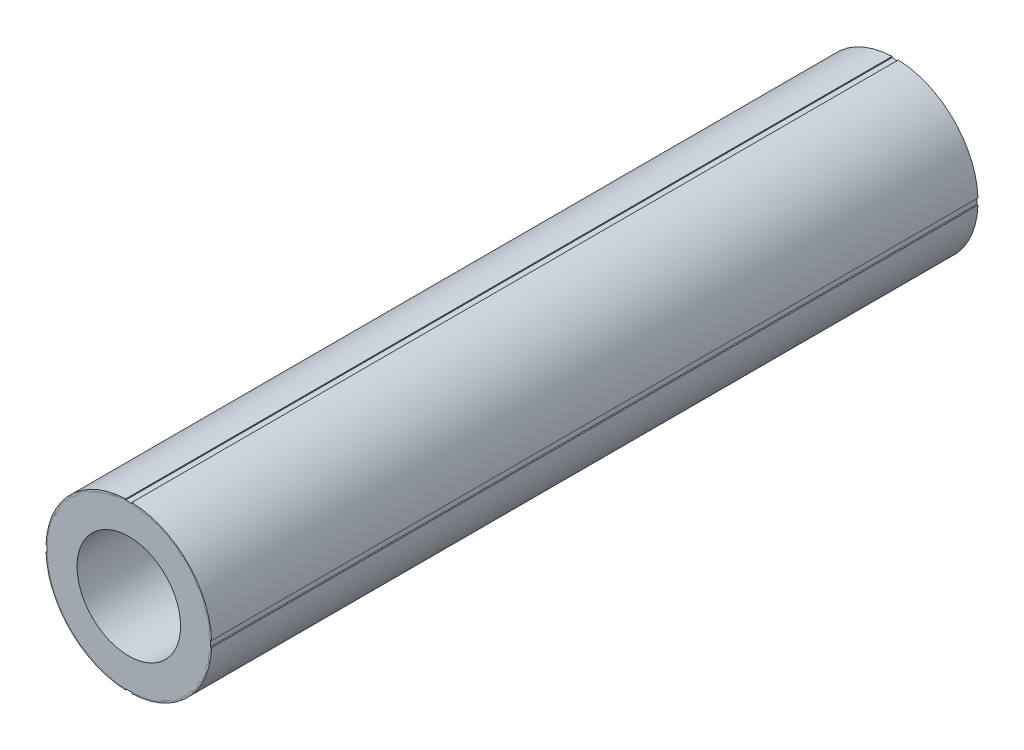
ISO-10303-21;
HEADER;
FILE_DESCRIPTION(('STEP AP214'),'2;1');
FILE_NAME('part.step','',(''),(''),'','','');
FILE_SCHEMA(('AUTOMOTIVE_DESIGN { 1 0 10303 214 1 1 1 1 }'));
ENDSEC;
DATA;
#1=APPLICATION_CONTEXT('core data for automotive mechanical design processes');
#2=APPLICATION_PROTOCOL_DEFINITION('international standard','automotive_design',2000,#1);
#3=PRODUCT_CONTEXT('',#1,'mechanical');
#4=PRODUCT('Part','Part','',(#3));
#5=PRODUCT_RELATED_PRODUCT_CATEGORY('part','',(#4));
#6=PRODUCT_DEFINITION_FORMATION('','',#4);
#7=PRODUCT_DEFINITION_CONTEXT('part definition',#1,'design');
#8=PRODUCT_DEFINITION('design','',#6,#7);
#9=PRODUCT_DEFINITION_SHAPE('','',#8);
#10=(LENGTH_UNIT() NAMED_UNIT(*) SI_UNIT(.MILLI.,.METRE.));
#11=(NAMED_UNIT(*) PLANE_ANGLE_UNIT() SI_UNIT($,.RADIAN.));
#12=(NAMED_UNIT(*) SI_UNIT($,.STERADIAN.) SOLID_ANGLE_UNIT());
#13=UNCERTAINTY_MEASURE_WITH_UNIT(LENGTH_MEASURE(1.E-05),#10,'distance_accuracy_value','');
#14=(GEOMETRIC_REPRESENTATION_CONTEXT(3) GLOBAL_UNCERTAINTY_ASSIGNED_CONTEXT((#13)) GLOBAL_UNIT_ASSIGNED_CONTEXT((#10,
#11,#12)) REPRESENTATION_CONTEXT('',''));
#15=CARTESIAN_POINT('',(0.,0.,0.));
#16=DIRECTION('',(0.,0.,1.));
#17=DIRECTION('',(1.,0.,0.));
#18=AXIS2_PLACEMENT_3D('',#15,#16,#17);
#19=CARTESIAN_POINT('',(0.,0.,3.7));
#20=DIRECTION('',(0.,0.,1.));
#21=DIRECTION('',(1.,0.,0.));
#22=AXIS2_PLACEMENT_3D('',#19,#20,#21);
#23=PLANE('',#22);
#24=CARTESIAN_POINT('',(0.,0.,3.7));
#25=DIRECTION('',(0.,0.,1.));
#26=DIRECTION('',(1.,0.,0.));
#27=AXIS2_PLACEMENT_3D('',#24,#25,#26);
#28=CIRCLE('',#27,0.395);
#29=CARTESIAN_POINT('',(0.395,0.,3.7));
#30=VERTEX_POINT('',#29);
#31=EDGE_CURVE('E12',#30,#30,#28,.T.);
#32=ORIENTED_EDGE('',*,*,#31,.T.);
#33=EDGE_LOOP('',(#32));
#34=FACE_BOUND('',#33,.T.);
#35=CARTESIAN_POINT('',(0.,0.,3.7));
#36=DIRECTION('',(0.,0.,1.));
#37=DIRECTION('',(1.,0.,0.));
#38=AXIS2_PLACEMENT_3D('',#35,#36,#37);
#39=CIRCLE('',#38,0.25);
#40=CARTESIAN_POINT('',(0.25,0.,3.7));
#41=VERTEX_POINT('',#40);
#42=EDGE_CURVE('E249',#41,#41,#39,.T.);
#43=ORIENTED_EDGE('',*,*,#42,.F.);
#44=EDGE_LOOP('',(#43));
#45=FACE_BOUND('',#44,.T.);
#46=ADVANCED_FACE('F236',(#34,#45),#23,.T.);
#47=CARTESIAN_POINT('',(0.,0.,0.));
#48=DIRECTION('',(0.,0.,1.));
#49=DIRECTION('',(1.,0.,0.));
#50=AXIS2_PLACEMENT_3D('',#47,#48,#49);
#51=PLANE('',#50);
#52=CARTESIAN_POINT('',(0.,0.,0.));
#53=DIRECTION('',(0.,0.,1.));
#54=DIRECTION('',(1.,0.,0.));
#55=AXIS2_PLACEMENT_3D('',#52,#53,#54);
#56=CIRCLE('',#55,0.395);
#57=CARTESIAN_POINT('',(0.395,0.,0.));
#58=VERTEX_POINT('',#57);
#59=EDGE_CURVE('E240',#58,#58,#56,.T.);
#60=ORIENTED_EDGE('',*,*,#59,.F.);
#61=EDGE_LOOP('',(#60));
#62=FACE_BOUND('',#61,.T.);
#63=CARTESIAN_POINT('',(0.,0.,0.));
#64=DIRECTION('',(0.,0.,1.));
#65=DIRECTION('',(1.,0.,0.));
#66=AXIS2_PLACEMENT_3D('',#63,#64,#65);
#67=CIRCLE('',#66,0.25);
#68=CARTESIAN_POINT('',(0.25,0.,0.));
#69=VERTEX_POINT('',#68);
#70=EDGE_CURVE('E247',#69,#69,#67,.T.);
#71=ORIENTED_EDGE('',*,*,#70,.T.);
#72=EDGE_LOOP('',(#71));
#73=FACE_BOUND('',#72,.T.);
#74=ADVANCED_FACE('F255',(#62,#73),#51,.F.);
#75=CARTESIAN_POINT('',(0.,0.,3.7));
#76=DIRECTION('',(0.,0.,-1.));
#77=DIRECTION('',(-1.,0.,0.));
#78=AXIS2_PLACEMENT_3D('',#75,#76,#77);
#79=CYLINDRICAL_SURFACE('',#78,0.395);
#80=ORIENTED_EDGE('',*,*,#31,.F.);
#81=EDGE_LOOP('',(#80));
#82=FACE_BOUND('',#81,.T.);
#83=ORIENTED_EDGE('',*,*,#59,.T.);
#84=EDGE_LOOP('',(#83));
#85=FACE_BOUND('',#84,.T.);
#86=ADVANCED_FACE('F238',(#82,#85),#79,.T.);
#87=CARTESIAN_POINT('',(0.,0.,0.));
#88=DIRECTION('',(0.,0.,1.));
#89=DIRECTION('',(1.,0.,0.));
#90=AXIS2_PLACEMENT_3D('',#87,#88,#89);
#91=CYLINDRICAL_SURFACE('',#90,0.25);
#92=ORIENTED_EDGE('',*,*,#70,.F.);
#93=EDGE_LOOP('',(#92));
#94=FACE_BOUND('',#93,.T.);
#95=ORIENTED_EDGE('',*,*,#42,.T.);
#96=EDGE_LOOP('',(#95));
#97=FACE_BOUND('',#96,.T.);
#98=ADVANCED_FACE('F257',(#94,#97),#91,.F.);
#99=CLOSED_SHELL('',(#46,#74,#86,#98));
#100=MANIFOLD_SOLID_BREP('B2',#99);
#101=CARTESIAN_POINT('',(0.,0.,3.7));
#102=DIRECTION('',(0.,0.,1.));
#103=DIRECTION('',(1.,0.,0.));
#104=AXIS2_PLACEMENT_3D('',#101,#102,#103);
#105=PLANE('',#104);
#106=CARTESIAN_POINT('',(0.,0.,3.7));
#107=DIRECTION('',(0.,0.,1.));
#108=DIRECTION('',(1.,0.,0.));
#109=AXIS2_PLACEMENT_3D('',#106,#107,#108);
#110=CIRCLE('',#109,0.39);
#111=CARTESIAN_POINT('',(0.015,-0.389711431702997,3.7));
#112=VERTEX_POINT('',#111);
#113=CARTESIAN_POINT('',(0.389711431702997,-0.0150000000000004,3.7));
#114=VERTEX_POINT('',#113);
#115=EDGE_CURVE('E317',#112,#114,#110,.T.);
#116=ORIENTED_EDGE('',*,*,#115,.F.);
#117=DIRECTION('',(0.,1.,0.));
#118=VECTOR('',#117,1.);
#119=CARTESIAN_POINT('',(0.015,-0.500000000000001,3.7));
#120=LINE('',#119,#118);
#121=CARTESIAN_POINT('',(0.015,-0.399718651053463,3.7));
#122=VERTEX_POINT('',#121);
#123=EDGE_CURVE('E323',#122,#112,#120,.T.);
#124=ORIENTED_EDGE('',*,*,#123,.F.);
#125=CARTESIAN_POINT('',(0.,0.,3.7));
#126=DIRECTION('',(0.,0.,1.));
#127=DIRECTION('',(1.,0.,0.));
#128=AXIS2_PLACEMENT_3D('',#125,#126,#127);
#129=CIRCLE('',#128,0.4);
#130=CARTESIAN_POINT('',(0.399718651053463,-0.0150000000000004,3.7));
#131=VERTEX_POINT('',#130);
#132=EDGE_CURVE('E370',#122,#131,#129,.T.);
#133=ORIENTED_EDGE('',*,*,#132,.T.);
#134=DIRECTION('',(-1.,0.,0.));
#135=VECTOR('',#134,1.);
#136=CARTESIAN_POINT('',(0.5,-0.0150000000000004,3.7));
#137=LINE('',#136,#135);
#138=EDGE_CURVE('E360',#131,#114,#137,.T.);
#139=ORIENTED_EDGE('',*,*,#138,.T.);
#140=EDGE_LOOP('',(#116,#124,#133,#139));
#141=FACE_BOUND('',#140,.T.);
#142=ADVANCED_FACE('F314',(#141),#105,.T.);
#143=CARTESIAN_POINT('',(0.,0.,0.));
#144=DIRECTION('',(0.,0.,1.));
#145=DIRECTION('',(1.,0.,0.));
#146=AXIS2_PLACEMENT_3D('',#143,#144,#145);
#147=PLANE('',#146);
#148=DIRECTION('',(0.,1.,0.));
#149=VECTOR('',#148,1.);
#150=CARTESIAN_POINT('',(0.015,-0.500000000000001,0.));
#151=LINE('',#150,#149);
#152=CARTESIAN_POINT('',(0.015,-0.399718651053463,0.));
#153=VERTEX_POINT('',#152);
#154=CARTESIAN_POINT('',(0.015,-0.389711431702997,0.));
#155=VERTEX_POINT('',#154);
#156=EDGE_CURVE('E331',#153,#155,#151,.T.);
#157=ORIENTED_EDGE('',*,*,#156,.T.);
#158=CARTESIAN_POINT('',(0.,0.,0.));
#159=DIRECTION('',(0.,0.,1.));
#160=DIRECTION('',(1.,0.,0.));
#161=AXIS2_PLACEMENT_3D('',#158,#159,#160);
#162=CIRCLE('',#161,0.39);
#163=CARTESIAN_POINT('',(0.389711431702997,-0.0150000000000004,0.));
#164=VERTEX_POINT('',#163);
#165=EDGE_CURVE('E377',#155,#164,#162,.T.);
#166=ORIENTED_EDGE('',*,*,#165,.T.);
#167=DIRECTION('',(-1.,0.,0.));
#168=VECTOR('',#167,1.);
#169=CARTESIAN_POINT('',(0.5,-0.0150000000000004,0.));
#170=LINE('',#169,#168);
#171=CARTESIAN_POINT('',(0.399718651053463,-0.0150000000000004,0.));
#172=VERTEX_POINT('',#171);
#173=EDGE_CURVE('E355',#172,#164,#170,.T.);
#174=ORIENTED_EDGE('',*,*,#173,.F.);
#175=CARTESIAN_POINT('',(0.,0.,0.));
#176=DIRECTION('',(0.,0.,1.));
#177=DIRECTION('',(1.,0.,0.));
#178=AXIS2_PLACEMENT_3D('',#175,#176,#177);
#179=CIRCLE('',#178,0.4);
#180=EDGE_CURVE('E373',#153,#172,#179,.T.);
#181=ORIENTED_EDGE('',*,*,#180,.F.);
#182=EDGE_LOOP('',(#157,#166,#174,#181));
#183=FACE_BOUND('',#182,.T.);
#184=ADVANCED_FACE('F385',(#183),#147,.F.);
#185=CARTESIAN_POINT('',(0.,0.,3.7));
#186=DIRECTION('',(0.,0.,-1.));
#187=DIRECTION('',(-1.,0.,0.));
#188=AXIS2_PLACEMENT_3D('',#185,#186,#187);
#189=CYLINDRICAL_SURFACE('',#188,0.4);
#190=DIRECTION('',(0.,0.,-1.));
#191=VECTOR('',#190,1.);
#192=CARTESIAN_POINT('',(0.015,-0.399718651053463,3.7));
#193=LINE('',#192,#191);
#194=EDGE_CURVE('E349',#153,#122,#193,.F.);
#195=ORIENTED_EDGE('',*,*,#194,.F.);
#196=ORIENTED_EDGE('',*,*,#180,.T.);
#197=DIRECTION('',(0.,0.,-1.));
#198=VECTOR('',#197,1.);
#199=CARTESIAN_POINT('',(0.399718651053463,-0.0150000000000004,3.7));
#200=LINE('',#199,#198);
#201=EDGE_CURVE('E346',#172,#131,#200,.F.);
#202=ORIENTED_EDGE('',*,*,#201,.T.);
#203=ORIENTED_EDGE('',*,*,#132,.F.);
#204=EDGE_LOOP('',(#195,#196,#202,#203));
#205=FACE_BOUND('',#204,.T.);
#206=ADVANCED_FACE('F387',(#205),#189,.T.);
#207=CARTESIAN_POINT('',(0.,0.,3.7));
#208=DIRECTION('',(0.,0.,-1.));
#209=DIRECTION('',(-1.,0.,0.));
#210=AXIS2_PLACEMENT_3D('',#207,#208,#209);
#211=CYLINDRICAL_SURFACE('',#210,0.39);
#212=ORIENTED_EDGE('',*,*,#165,.F.);
#213=DIRECTION('',(0.,0.,-1.));
#214=VECTOR('',#213,1.);
#215=CARTESIAN_POINT('',(0.015,-0.389711431702997,3.7));
#216=LINE('',#215,#214);
#217=EDGE_CURVE('E234',#112,#155,#216,.T.);
#218=ORIENTED_EDGE('',*,*,#217,.F.);
#219=ORIENTED_EDGE('',*,*,#115,.T.);
#220=DIRECTION('',(0.,0.,-1.));
#221=VECTOR('',#220,1.);
#222=CARTESIAN_POINT('',(0.389711431702997,-0.0150000000000004,3.7));
#223=LINE('',#222,#221);
#224=EDGE_CURVE('E357',#114,#164,#223,.T.);
#225=ORIENTED_EDGE('',*,*,#224,.T.);
#226=EDGE_LOOP('',(#212,#218,#219,#225));
#227=FACE_BOUND('',#226,.T.);
#228=ADVANCED_FACE('F372',(#227),#211,.F.);
#229=CARTESIAN_POINT('',(0.5,-0.0150000000000004,3.7));
#230=DIRECTION('',(0.,-1.,0.));
#231=DIRECTION('',(1.,0.,0.));
#232=AXIS2_PLACEMENT_3D('',#229,#230,#231);
#233=PLANE('',#232);
#234=ORIENTED_EDGE('',*,*,#173,.T.);
#235=ORIENTED_EDGE('',*,*,#224,.F.);
#236=ORIENTED_EDGE('',*,*,#138,.F.);
#237=ORIENTED_EDGE('',*,*,#201,.F.);
#238=EDGE_LOOP('',(#234,#235,#236,#237));
#239=FACE_BOUND('',#238,.T.);
#240=ADVANCED_FACE('F359',(#239),#233,.F.);
#241=CARTESIAN_POINT('',(0.015,-0.500000000000001,3.7));
#242=DIRECTION('',(-1.,0.,0.));
#243=DIRECTION('',(0.,0.,1.));
#244=AXIS2_PLACEMENT_3D('',#241,#242,#243);
#245=PLANE('',#244);
#246=ORIENTED_EDGE('',*,*,#194,.T.);
#247=ORIENTED_EDGE('',*,*,#123,.T.);
#248=ORIENTED_EDGE('',*,*,#217,.T.);
#249=ORIENTED_EDGE('',*,*,#156,.F.);
#250=EDGE_LOOP('',(#246,#247,#248,#249));
#251=FACE_BOUND('',#250,.T.);
#252=ADVANCED_FACE('F424',(#251),#245,.T.);
#253=CLOSED_SHELL('',(#142,#184,#206,#228,#240,#252));
#254=MANIFOLD_SOLID_BREP('B7',#253);
#255=CARTESIAN_POINT('',(0.,0.,3.7));
#256=DIRECTION('',(0.,0.,-1.));
#257=DIRECTION('',(-1.,0.,0.));
#258=AXIS2_PLACEMENT_3D('',#255,#256,#257);
#259=CYLINDRICAL_SURFACE('',#258,0.39);
#260=CARTESIAN_POINT('',(0.,0.,3.7));
#261=DIRECTION('',(0.,0.,1.));
#262=DIRECTION('',(1.,0.,0.));
#263=AXIS2_PLACEMENT_3D('',#260,#261,#262);
#264=CIRCLE('',#263,0.39);
#265=CARTESIAN_POINT('',(-0.015,0.389711431702997,3.7));
#266=VERTEX_POINT('',#265);
#267=CARTESIAN_POINT('',(-0.389711431702997,0.0149999999999995,3.7));
#268=VERTEX_POINT('',#267);
#269=EDGE_CURVE('E522',#266,#268,#264,.T.);
#270=ORIENTED_EDGE('',*,*,#269,.T.);
#271=DIRECTION('',(0.,0.,-1.));
#272=VECTOR('',#271,1.);
#273=CARTESIAN_POINT('',(-0.389711431702997,0.0149999999999995,3.7));
#274=LINE('',#273,#272);
#275=CARTESIAN_POINT('',(-0.389711431702997,0.0149999999999995,0.));
#276=VERTEX_POINT('',#275);
#277=EDGE_CURVE('E520',#268,#276,#274,.T.);
#278=ORIENTED_EDGE('',*,*,#277,.T.);
#279=CARTESIAN_POINT('',(0.,0.,0.));
#280=DIRECTION('',(0.,0.,1.));
#281=DIRECTION('',(1.,0.,0.));
#282=AXIS2_PLACEMENT_3D('',#279,#280,#281);
#283=CIRCLE('',#282,0.39);
#284=CARTESIAN_POINT('',(-0.015,0.389711431702997,0.));
#285=VERTEX_POINT('',#284);
#286=EDGE_CURVE('E515',#285,#276,#283,.T.);
#287=ORIENTED_EDGE('',*,*,#286,.F.);
#288=DIRECTION('',(0.,0.,-1.));
#289=VECTOR('',#288,1.);
#290=CARTESIAN_POINT('',(-0.015,0.389711431702997,3.7));
#291=LINE('',#290,#289);
#292=EDGE_CURVE('E494',#266,#285,#291,.T.);
#293=ORIENTED_EDGE('',*,*,#292,.F.);
#294=EDGE_LOOP('',(#270,#278,#287,#293));
#295=FACE_BOUND('',#294,.T.);
#296=ADVANCED_FACE('F460',(#295),#259,.F.);
#297=CARTESIAN_POINT('',(0.,0.,3.7));
#298=DIRECTION('',(0.,0.,-1.));
#299=DIRECTION('',(-1.,0.,0.));
#300=AXIS2_PLACEMENT_3D('',#297,#298,#299);
#301=CYLINDRICAL_SURFACE('',#300,0.4);
#302=DIRECTION('',(0.,0.,-1.));
#303=VECTOR('',#302,1.);
#304=CARTESIAN_POINT('',(-0.399718651053463,0.0149999999999995,3.7));
#305=LINE('',#304,#303);
#306=CARTESIAN_POINT('',(-0.399718651053463,0.0149999999999995,3.7));
#307=VERTEX_POINT('',#306);
#308=CARTESIAN_POINT('',(-0.399718651053463,0.0149999999999995,0.));
#309=VERTEX_POINT('',#308);
#310=EDGE_CURVE('E470',#307,#309,#305,.T.);
#311=ORIENTED_EDGE('',*,*,#310,.F.);
#312=CARTESIAN_POINT('',(0.,0.,3.7));
#313=DIRECTION('',(0.,0.,1.));
#314=DIRECTION('',(1.,0.,0.));
#315=AXIS2_PLACEMENT_3D('',#312,#313,#314);
#316=CIRCLE('',#315,0.4);
#317=CARTESIAN_POINT('',(-0.015,0.399718651053463,3.7));
#318=VERTEX_POINT('',#317);
#319=EDGE_CURVE('E527',#318,#307,#316,.T.);
#320=ORIENTED_EDGE('',*,*,#319,.F.);
#321=DIRECTION('',(0.,0.,-1.));
#322=VECTOR('',#321,1.);
#323=CARTESIAN_POINT('',(-0.015,0.399718651053463,3.7));
#324=LINE('',#323,#322);
#325=CARTESIAN_POINT('',(-0.015,0.399718651053463,0.));
#326=VERTEX_POINT('',#325);
#327=EDGE_CURVE('E519',#318,#326,#324,.T.);
#328=ORIENTED_EDGE('',*,*,#327,.T.);
#329=CARTESIAN_POINT('',(0.,0.,0.));
#330=DIRECTION('',(0.,0.,1.));
#331=DIRECTION('',(1.,0.,0.));
#332=AXIS2_PLACEMENT_3D('',#329,#330,#331);
#333=CIRCLE('',#332,0.4);
#334=EDGE_CURVE('E464',#326,#309,#333,.T.);
#335=ORIENTED_EDGE('',*,*,#334,.T.);
#336=EDGE_LOOP('',(#311,#320,#328,#335));
#337=FACE_BOUND('',#336,.T.);
#338=ADVANCED_FACE('F518',(#337),#301,.T.);
#339=CARTESIAN_POINT('',(0.,0.,0.));
#340=DIRECTION('',(0.,0.,1.));
#341=DIRECTION('',(1.,0.,0.));
#342=AXIS2_PLACEMENT_3D('',#339,#340,#341);
#343=PLANE('',#342);
#344=DIRECTION('',(-1.,0.,0.));
#345=VECTOR('',#344,1.);
#346=CARTESIAN_POINT('',(0.5,0.0149999999999996,0.));
#347=LINE('',#346,#345);
#348=EDGE_CURVE('E501',#276,#309,#347,.T.);
#349=ORIENTED_EDGE('',*,*,#348,.T.);
#350=ORIENTED_EDGE('',*,*,#334,.F.);
#351=DIRECTION('',(0.,1.,0.));
#352=VECTOR('',#351,1.);
#353=CARTESIAN_POINT('',(-0.015,-0.500000000000001,0.));
#354=LINE('',#353,#352);
#355=EDGE_CURVE('E508',#285,#326,#354,.T.);
#356=ORIENTED_EDGE('',*,*,#355,.F.);
#357=ORIENTED_EDGE('',*,*,#286,.T.);
#358=EDGE_LOOP('',(#349,#350,#356,#357));
#359=FACE_BOUND('',#358,.T.);
#360=ADVANCED_FACE('F513',(#359),#343,.F.);
#361=CARTESIAN_POINT('',(0.,0.,3.7));
#362=DIRECTION('',(0.,0.,1.));
#363=DIRECTION('',(1.,0.,0.));
#364=AXIS2_PLACEMENT_3D('',#361,#362,#363);
#365=PLANE('',#364);
#366=ORIENTED_EDGE('',*,*,#319,.T.);
#367=DIRECTION('',(-1.,0.,0.));
#368=VECTOR('',#367,1.);
#369=CARTESIAN_POINT('',(0.5,0.0149999999999996,3.7));
#370=LINE('',#369,#368);
#371=EDGE_CURVE('E312',#268,#307,#370,.T.);
#372=ORIENTED_EDGE('',*,*,#371,.F.);
#373=ORIENTED_EDGE('',*,*,#269,.F.);
#374=DIRECTION('',(0.,1.,0.));
#375=VECTOR('',#374,1.);
#376=CARTESIAN_POINT('',(-0.015,-0.500000000000001,3.7));
#377=LINE('',#376,#375);
#378=EDGE_CURVE('E497',#266,#318,#377,.T.);
#379=ORIENTED_EDGE('',*,*,#378,.T.);
#380=EDGE_LOOP('',(#366,#372,#373,#379));
#381=FACE_BOUND('',#380,.T.);
#382=ADVANCED_FACE('F462',(#381),#365,.T.);
#383=CARTESIAN_POINT('',(-0.015,-0.500000000000001,3.7));
#384=DIRECTION('',(-1.,0.,0.));
#385=DIRECTION('',(0.,0.,1.));
#386=AXIS2_PLACEMENT_3D('',#383,#384,#385);
#387=PLANE('',#386);
#388=ORIENTED_EDGE('',*,*,#378,.F.);
#389=ORIENTED_EDGE('',*,*,#292,.T.);
#390=ORIENTED_EDGE('',*,*,#355,.T.);
#391=ORIENTED_EDGE('',*,*,#327,.F.);
#392=EDGE_LOOP('',(#388,#389,#390,#391));
#393=FACE_BOUND('',#392,.T.);
#394=ADVANCED_FACE('F535',(#393),#387,.F.);
#395=CARTESIAN_POINT('',(0.5,0.0149999999999996,3.7));
#396=DIRECTION('',(0.,-1.,0.));
#397=DIRECTION('',(1.,0.,0.));
#398=AXIS2_PLACEMENT_3D('',#395,#396,#397);
#399=PLANE('',#398);
#400=ORIENTED_EDGE('',*,*,#310,.T.);
#401=ORIENTED_EDGE('',*,*,#348,.F.);
#402=ORIENTED_EDGE('',*,*,#277,.F.);
#403=ORIENTED_EDGE('',*,*,#371,.T.);
#404=EDGE_LOOP('',(#400,#401,#402,#403));
#405=FACE_BOUND('',#404,.T.);
#406=ADVANCED_FACE('F503',(#405),#399,.T.);
#407=CLOSED_SHELL('',(#296,#338,#360,#382,#394,#406));
#408=MANIFOLD_SOLID_BREP('B228',#407);
#409=CARTESIAN_POINT('',(0.,0.,3.7));
#410=DIRECTION('',(0.,0.,-1.));
#411=DIRECTION('',(-1.,0.,0.));
#412=AXIS2_PLACEMENT_3D('',#409,#410,#411);
#413=CYLINDRICAL_SURFACE('',#412,0.4);
#414=DIRECTION('',(0.,0.,-1.));
#415=VECTOR('',#414,1.);
#416=CARTESIAN_POINT('',(0.399718651053463,0.0149999999999996,3.7));
#417=LINE('',#416,#415);
#418=CARTESIAN_POINT('',(0.399718651053463,0.0149999999999996,0.));
#419=VERTEX_POINT('',#418);
#420=CARTESIAN_POINT('',(0.399718651053463,0.0149999999999996,3.7));
#421=VERTEX_POINT('',#420);
#422=EDGE_CURVE('E666',#419,#421,#417,.F.);
#423=ORIENTED_EDGE('',*,*,#422,.F.);
#424=CARTESIAN_POINT('',(0.,0.,0.));
#425=DIRECTION('',(0.,0.,1.));
#426=DIRECTION('',(1.,0.,0.));
#427=AXIS2_PLACEMENT_3D('',#424,#425,#426);
#428=CIRCLE('',#427,0.4);
#429=CARTESIAN_POINT('',(0.015,0.399718651053463,0.));
#430=VERTEX_POINT('',#429);
#431=EDGE_CURVE('E673',#419,#430,#428,.T.);
#432=ORIENTED_EDGE('',*,*,#431,.T.);
#433=DIRECTION('',(0.,0.,-1.));
#434=VECTOR('',#433,1.);
#435=CARTESIAN_POINT('',(0.015,0.399718651053463,3.7));
#436=LINE('',#435,#434);
#437=CARTESIAN_POINT('',(0.015,0.399718651053463,3.7));
#438=VERTEX_POINT('',#437);
#439=EDGE_CURVE('E646',#438,#430,#436,.T.);
#440=ORIENTED_EDGE('',*,*,#439,.F.);
#441=CARTESIAN_POINT('',(0.,0.,3.7));
#442=DIRECTION('',(0.,0.,1.));
#443=DIRECTION('',(1.,0.,0.));
#444=AXIS2_PLACEMENT_3D('',#441,#442,#443);
#445=CIRCLE('',#444,0.4);
#446=EDGE_CURVE('E651',#421,#438,#445,.T.);
#447=ORIENTED_EDGE('',*,*,#446,.F.);
#448=EDGE_LOOP('',(#423,#432,#440,#447));
#449=FACE_BOUND('',#448,.T.);
#450=ADVANCED_FACE('F605',(#449),#413,.T.);
#451=CARTESIAN_POINT('',(0.,0.,3.7));
#452=DIRECTION('',(0.,0.,-1.));
#453=DIRECTION('',(-1.,0.,0.));
#454=AXIS2_PLACEMENT_3D('',#451,#452,#453);
#455=CYLINDRICAL_SURFACE('',#454,0.39);
#456=CARTESIAN_POINT('',(0.,0.,0.));
#457=DIRECTION('',(0.,0.,1.));
#458=DIRECTION('',(1.,0.,0.));
#459=AXIS2_PLACEMENT_3D('',#456,#457,#458);
#460=CIRCLE('',#459,0.39);
#461=CARTESIAN_POINT('',(0.389711431702997,0.0149999999999996,0.));
#462=VERTEX_POINT('',#461);
#463=CARTESIAN_POINT('',(0.015,0.389711431702997,0.));
#464=VERTEX_POINT('',#463);
#465=EDGE_CURVE('E652',#462,#464,#460,.T.);
#466=ORIENTED_EDGE('',*,*,#465,.F.);
#467=DIRECTION('',(0.,0.,-1.));
#468=VECTOR('',#467,1.);
#469=CARTESIAN_POINT('',(0.389711431702997,0.0149999999999996,3.7));
#470=LINE('',#469,#468);
#471=CARTESIAN_POINT('',(0.389711431702997,0.0149999999999996,3.7));
#472=VERTEX_POINT('',#471);
#473=EDGE_CURVE('E458',#472,#462,#470,.T.);
#474=ORIENTED_EDGE('',*,*,#473,.F.);
#475=CARTESIAN_POINT('',(0.,0.,3.7));
#476=DIRECTION('',(0.,0.,1.));
#477=DIRECTION('',(1.,0.,0.));
#478=AXIS2_PLACEMENT_3D('',#475,#476,#477);
#479=CIRCLE('',#478,0.39);
#480=CARTESIAN_POINT('',(0.015,0.389711431702997,3.7));
#481=VERTEX_POINT('',#480);
#482=EDGE_CURVE('E659',#472,#481,#479,.T.);
#483=ORIENTED_EDGE('',*,*,#482,.T.);
#484=DIRECTION('',(0.,0.,-1.));
#485=VECTOR('',#484,1.);
#486=CARTESIAN_POINT('',(0.015,0.389711431702997,3.7));
#487=LINE('',#486,#485);
#488=EDGE_CURVE('E644',#481,#464,#487,.T.);
#489=ORIENTED_EDGE('',*,*,#488,.T.);
#490=EDGE_LOOP('',(#466,#474,#483,#489));
#491=FACE_BOUND('',#490,.T.);
#492=ADVANCED_FACE('F656',(#491),#455,.F.);
#493=CARTESIAN_POINT('',(0.,0.,0.));
#494=DIRECTION('',(0.,0.,1.));
#495=DIRECTION('',(1.,0.,0.));
#496=AXIS2_PLACEMENT_3D('',#493,#494,#495);
#497=PLANE('',#496);
#498=DIRECTION('',(-1.,0.,0.));
#499=VECTOR('',#498,1.);
#500=CARTESIAN_POINT('',(0.5,0.0149999999999996,0.));
#501=LINE('',#500,#499);
#502=EDGE_CURVE('E623',#419,#462,#501,.T.);
#503=ORIENTED_EDGE('',*,*,#502,.T.);
#504=ORIENTED_EDGE('',*,*,#465,.T.);
#505=DIRECTION('',(0.,1.,0.));
#506=VECTOR('',#505,1.);
#507=CARTESIAN_POINT('',(0.015,-0.500000000000001,0.));
#508=LINE('',#507,#506);
#509=EDGE_CURVE('E609',#464,#430,#508,.T.);
#510=ORIENTED_EDGE('',*,*,#509,.T.);
#511=ORIENTED_EDGE('',*,*,#431,.F.);
#512=EDGE_LOOP('',(#503,#504,#510,#511));
#513=FACE_BOUND('',#512,.T.);
#514=ADVANCED_FACE('F661',(#513),#497,.F.);
#515=CARTESIAN_POINT('',(0.,0.,3.7));
#516=DIRECTION('',(0.,0.,1.));
#517=DIRECTION('',(1.,0.,0.));
#518=AXIS2_PLACEMENT_3D('',#515,#516,#517);
#519=PLANE('',#518);
#520=ORIENTED_EDGE('',*,*,#482,.F.);
#521=DIRECTION('',(-1.,0.,0.));
#522=VECTOR('',#521,1.);
#523=CARTESIAN_POINT('',(0.5,0.0149999999999996,3.7));
#524=LINE('',#523,#522);
#525=EDGE_CURVE('E615',#421,#472,#524,.T.);
#526=ORIENTED_EDGE('',*,*,#525,.F.);
#527=ORIENTED_EDGE('',*,*,#446,.T.);
#528=DIRECTION('',(0.,1.,0.));
#529=VECTOR('',#528,1.);
#530=CARTESIAN_POINT('',(0.015,-0.500000000000001,3.7));
#531=LINE('',#530,#529);
#532=EDGE_CURVE('E640',#481,#438,#531,.T.);
#533=ORIENTED_EDGE('',*,*,#532,.F.);
#534=EDGE_LOOP('',(#520,#526,#527,#533));
#535=FACE_BOUND('',#534,.T.);
#536=ADVANCED_FACE('F679',(#535),#519,.T.);
#537=CARTESIAN_POINT('',(0.015,-0.500000000000001,3.7));
#538=DIRECTION('',(-1.,0.,0.));
#539=DIRECTION('',(0.,0.,1.));
#540=AXIS2_PLACEMENT_3D('',#537,#538,#539);
#541=PLANE('',#540);
#542=ORIENTED_EDGE('',*,*,#439,.T.);
#543=ORIENTED_EDGE('',*,*,#509,.F.);
#544=ORIENTED_EDGE('',*,*,#488,.F.);
#545=ORIENTED_EDGE('',*,*,#532,.T.);
#546=EDGE_LOOP('',(#542,#543,#544,#545));
#547=FACE_BOUND('',#546,.T.);
#548=ADVANCED_FACE('F607',(#547),#541,.T.);
#549=CARTESIAN_POINT('',(0.5,0.0149999999999996,3.7));
#550=DIRECTION('',(0.,-1.,0.));
#551=DIRECTION('',(1.,0.,0.));
#552=AXIS2_PLACEMENT_3D('',#549,#550,#551);
#553=PLANE('',#552);
#554=ORIENTED_EDGE('',*,*,#422,.T.);
#555=ORIENTED_EDGE('',*,*,#525,.T.);
#556=ORIENTED_EDGE('',*,*,#473,.T.);
#557=ORIENTED_EDGE('',*,*,#502,.F.);
#558=EDGE_LOOP('',(#554,#555,#556,#557));
#559=FACE_BOUND('',#558,.T.);
#560=ADVANCED_FACE('F677',(#559),#553,.T.);
#561=CLOSED_SHELL('',(#450,#492,#514,#536,#548,#560));
#562=MANIFOLD_SOLID_BREP('B306',#561);
#563=CARTESIAN_POINT('',(0.,0.,3.7));
#564=DIRECTION('',(0.,0.,-1.));
#565=DIRECTION('',(-1.,0.,0.));
#566=AXIS2_PLACEMENT_3D('',#563,#564,#565);
#567=CYLINDRICAL_SURFACE('',#566,0.4);
#568=CARTESIAN_POINT('',(0.,0.,0.));
#569=DIRECTION('',(0.,0.,1.));
#570=DIRECTION('',(1.,0.,0.));
#571=AXIS2_PLACEMENT_3D('',#568,#569,#570);
#572=CIRCLE('',#571,0.4);
#573=CARTESIAN_POINT('',(-0.399718651053463,-0.0150000000000005,0.));
#574=VERTEX_POINT('',#573);
#575=CARTESIAN_POINT('',(-0.015,-0.399718651053463,0.));
#576=VERTEX_POINT('',#575);
#577=EDGE_CURVE('E744',#574,#576,#572,.T.);
#578=ORIENTED_EDGE('',*,*,#577,.T.);
#579=DIRECTION('',(0.,0.,-1.));
#580=VECTOR('',#579,1.);
#581=CARTESIAN_POINT('',(-0.015,-0.399718651053463,3.7));
#582=LINE('',#581,#580);
#583=CARTESIAN_POINT('',(-0.015,-0.399718651053463,3.7));
#584=VERTEX_POINT('',#583);
#585=EDGE_CURVE('E800',#576,#584,#582,.F.);
#586=ORIENTED_EDGE('',*,*,#585,.T.);
#587=CARTESIAN_POINT('',(0.,0.,3.7));
#588=DIRECTION('',(0.,0.,1.));
#589=DIRECTION('',(1.,0.,0.));
#590=AXIS2_PLACEMENT_3D('',#587,#588,#589);
#591=CIRCLE('',#590,0.4);
#592=CARTESIAN_POINT('',(-0.399718651053463,-0.0150000000000005,3.7));
#593=VERTEX_POINT('',#592);
#594=EDGE_CURVE('E603',#593,#584,#591,.T.);
#595=ORIENTED_EDGE('',*,*,#594,.F.);
#596=DIRECTION('',(0.,0.,-1.));
#597=VECTOR('',#596,1.);
#598=CARTESIAN_POINT('',(-0.399718651053463,-0.0150000000000005,3.7));
#599=LINE('',#598,#597);
#600=EDGE_CURVE('E804',#593,#574,#599,.T.);
#601=ORIENTED_EDGE('',*,*,#600,.T.);
#602=EDGE_LOOP('',(#578,#586,#595,#601));
#603=FACE_BOUND('',#602,.T.);
#604=ADVANCED_FACE('F741',(#603),#567,.T.);
#605=CARTESIAN_POINT('',(0.,0.,3.7));
#606=DIRECTION('',(0.,0.,-1.));
#607=DIRECTION('',(-1.,0.,0.));
#608=AXIS2_PLACEMENT_3D('',#605,#606,#607);
#609=CYLINDRICAL_SURFACE('',#608,0.39);
#610=DIRECTION('',(0.,0.,-1.));
#611=VECTOR('',#610,1.);
#612=CARTESIAN_POINT('',(-0.015,-0.389711431702997,3.7));
#613=LINE('',#612,#611);
#614=CARTESIAN_POINT('',(-0.015,-0.389711431702997,3.7));
#615=VERTEX_POINT('',#614);
#616=CARTESIAN_POINT('',(-0.015,-0.389711431702997,0.));
#617=VERTEX_POINT('',#616);
#618=EDGE_CURVE('E778',#615,#617,#613,.T.);
#619=ORIENTED_EDGE('',*,*,#618,.T.);
#620=CARTESIAN_POINT('',(0.,0.,0.));
#621=DIRECTION('',(0.,0.,1.));
#622=DIRECTION('',(1.,0.,0.));
#623=AXIS2_PLACEMENT_3D('',#620,#621,#622);
#624=CIRCLE('',#623,0.39);
#625=CARTESIAN_POINT('',(-0.389711431702997,-0.0150000000000005,0.));
#626=VERTEX_POINT('',#625);
#627=EDGE_CURVE('E797',#626,#617,#624,.T.);
#628=ORIENTED_EDGE('',*,*,#627,.F.);
#629=DIRECTION('',(0.,0.,-1.));
#630=VECTOR('',#629,1.);
#631=CARTESIAN_POINT('',(-0.389711431702997,-0.0150000000000005,3.7));
#632=LINE('',#631,#630);
#633=CARTESIAN_POINT('',(-0.389711431702997,-0.0150000000000005,3.7));
#634=VERTEX_POINT('',#633);
#635=EDGE_CURVE('E787',#634,#626,#632,.T.);
#636=ORIENTED_EDGE('',*,*,#635,.F.);
#637=CARTESIAN_POINT('',(0.,0.,3.7));
#638=DIRECTION('',(0.,0.,1.));
#639=DIRECTION('',(1.,0.,0.));
#640=AXIS2_PLACEMENT_3D('',#637,#638,#639);
#641=CIRCLE('',#640,0.39);
#642=EDGE_CURVE('E792',#634,#615,#641,.T.);
#643=ORIENTED_EDGE('',*,*,#642,.T.);
#644=EDGE_LOOP('',(#619,#628,#636,#643));
#645=FACE_BOUND('',#644,.T.);
#646=ADVANCED_FACE('F796',(#645),#609,.F.);
#647=CARTESIAN_POINT('',(0.,0.,0.));
#648=DIRECTION('',(0.,0.,1.));
#649=DIRECTION('',(1.,0.,0.));
#650=AXIS2_PLACEMENT_3D('',#647,#648,#649);
#651=PLANE('',#650);
#652=ORIENTED_EDGE('',*,*,#627,.T.);
#653=DIRECTION('',(0.,1.,0.));
#654=VECTOR('',#653,1.);
#655=CARTESIAN_POINT('',(-0.015,-0.500000000000001,0.));
#656=LINE('',#655,#654);
#657=EDGE_CURVE('E755',#576,#617,#656,.T.);
#658=ORIENTED_EDGE('',*,*,#657,.F.);
#659=ORIENTED_EDGE('',*,*,#577,.F.);
#660=DIRECTION('',(-1.,0.,0.));
#661=VECTOR('',#660,1.);
#662=CARTESIAN_POINT('',(0.5,-0.0150000000000004,0.));
#663=LINE('',#662,#661);
#664=EDGE_CURVE('E794',#626,#574,#663,.T.);
#665=ORIENTED_EDGE('',*,*,#664,.F.);
#666=EDGE_LOOP('',(#652,#658,#659,#665));
#667=FACE_BOUND('',#666,.T.);
#668=ADVANCED_FACE('F814',(#667),#651,.F.);
#669=CARTESIAN_POINT('',(0.,0.,3.7));
#670=DIRECTION('',(0.,0.,1.));
#671=DIRECTION('',(1.,0.,0.));
#672=AXIS2_PLACEMENT_3D('',#669,#670,#671);
#673=PLANE('',#672);
#674=DIRECTION('',(0.,1.,0.));
#675=VECTOR('',#674,1.);
#676=CARTESIAN_POINT('',(-0.015,-0.500000000000001,3.7));
#677=LINE('',#676,#675);
#678=EDGE_CURVE('E781',#584,#615,#677,.T.);
#679=ORIENTED_EDGE('',*,*,#678,.T.);
#680=ORIENTED_EDGE('',*,*,#642,.F.);
#681=DIRECTION('',(-1.,0.,0.));
#682=VECTOR('',#681,1.);
#683=CARTESIAN_POINT('',(0.5,-0.0150000000000004,3.7));
#684=LINE('',#683,#682);
#685=EDGE_CURVE('E763',#634,#593,#684,.T.);
#686=ORIENTED_EDGE('',*,*,#685,.T.);
#687=ORIENTED_EDGE('',*,*,#594,.T.);
#688=EDGE_LOOP('',(#679,#680,#686,#687));
#689=FACE_BOUND('',#688,.T.);
#690=ADVANCED_FACE('F791',(#689),#673,.T.);
#691=CARTESIAN_POINT('',(0.5,-0.0150000000000004,3.7));
#692=DIRECTION('',(0.,-1.,0.));
#693=DIRECTION('',(1.,0.,0.));
#694=AXIS2_PLACEMENT_3D('',#691,#692,#693);
#695=PLANE('',#694);
#696=ORIENTED_EDGE('',*,*,#685,.F.);
#697=ORIENTED_EDGE('',*,*,#635,.T.);
#698=ORIENTED_EDGE('',*,*,#664,.T.);
#699=ORIENTED_EDGE('',*,*,#600,.F.);
#700=EDGE_LOOP('',(#696,#697,#698,#699));
#701=FACE_BOUND('',#700,.T.);
#702=ADVANCED_FACE('F811',(#701),#695,.F.);
#703=CARTESIAN_POINT('',(-0.015,-0.500000000000001,3.7));
#704=DIRECTION('',(-1.,0.,0.));
#705=DIRECTION('',(0.,0.,1.));
#706=AXIS2_PLACEMENT_3D('',#703,#704,#705);
#707=PLANE('',#706);
#708=ORIENTED_EDGE('',*,*,#657,.T.);
#709=ORIENTED_EDGE('',*,*,#618,.F.);
#710=ORIENTED_EDGE('',*,*,#678,.F.);
#711=ORIENTED_EDGE('',*,*,#585,.F.);
#712=EDGE_LOOP('',(#708,#709,#710,#711));
#713=FACE_BOUND('',#712,.T.);
#714=ADVANCED_FACE('F780',(#713),#707,.F.);
#715=CLOSED_SHELL('',(#604,#646,#668,#690,#702,#714));
#716=MANIFOLD_SOLID_BREP('B452',#715);
#717=ADVANCED_BREP_SHAPE_REPRESENTATION('',(#18,#100,#254,#408,#562,#716),#14);
#718=SHAPE_DEFINITION_REPRESENTATION(#9,#717);
ENDSEC;
END-ISO-10303-21;
